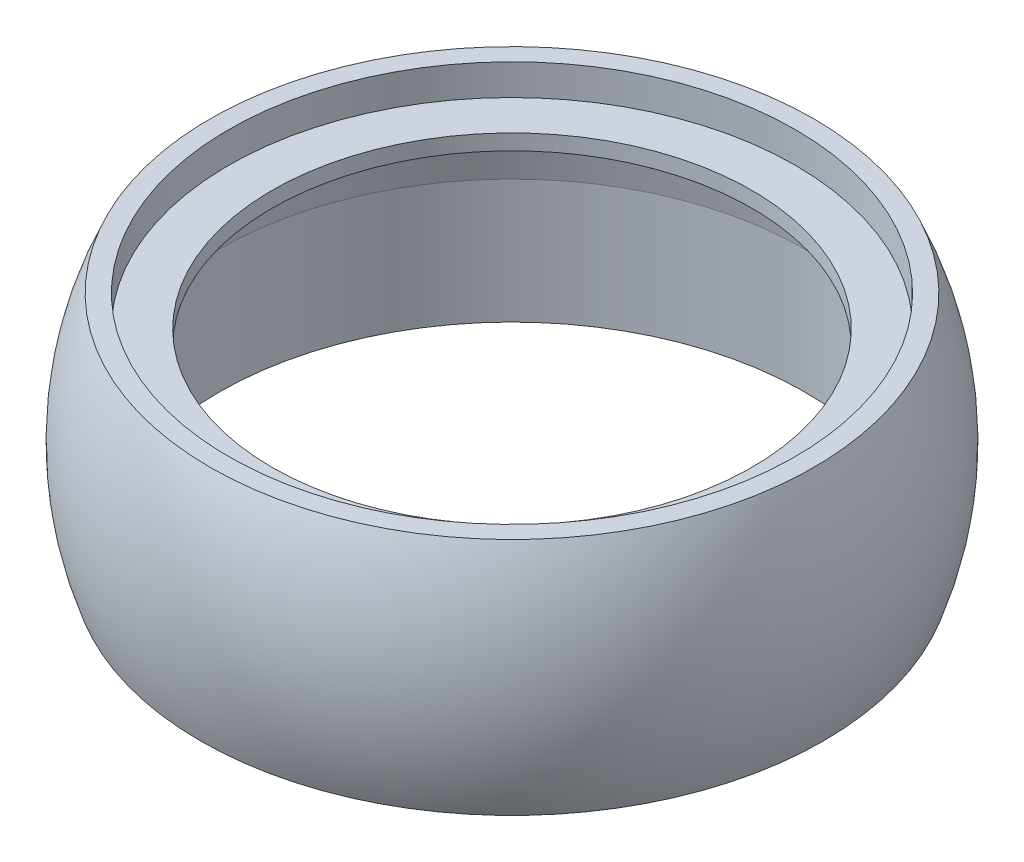
ISO-10303-21;
HEADER;
FILE_DESCRIPTION(('STEP AP214'),'2;1');
FILE_NAME('part.step','',(''),(''),'','','');
FILE_SCHEMA(('AUTOMOTIVE_DESIGN { 1 0 10303 214 1 1 1 1 }'));
ENDSEC;
DATA;
#1=APPLICATION_CONTEXT('core data for automotive mechanical design processes');
#2=APPLICATION_PROTOCOL_DEFINITION('international standard','automotive_design',2000,#1);
#3=PRODUCT_CONTEXT('',#1,'mechanical');
#4=PRODUCT('Part','Part','',(#3));
#5=PRODUCT_RELATED_PRODUCT_CATEGORY('part','',(#4));
#6=PRODUCT_DEFINITION_FORMATION('','',#4);
#7=PRODUCT_DEFINITION_CONTEXT('part definition',#1,'design');
#8=PRODUCT_DEFINITION('design','',#6,#7);
#9=PRODUCT_DEFINITION_SHAPE('','',#8);
#10=(LENGTH_UNIT() NAMED_UNIT(*) SI_UNIT(.MILLI.,.METRE.));
#11=(NAMED_UNIT(*) PLANE_ANGLE_UNIT() SI_UNIT($,.RADIAN.));
#12=(NAMED_UNIT(*) SI_UNIT($,.STERADIAN.) SOLID_ANGLE_UNIT());
#13=UNCERTAINTY_MEASURE_WITH_UNIT(LENGTH_MEASURE(1.E-05),#10,'distance_accuracy_value','');
#14=(GEOMETRIC_REPRESENTATION_CONTEXT(3) GLOBAL_UNCERTAINTY_ASSIGNED_CONTEXT((#13)) GLOBAL_UNIT_ASSIGNED_CONTEXT((#10,
#11,#12)) REPRESENTATION_CONTEXT('',''));
#15=CARTESIAN_POINT('',(0.,0.,0.));
#16=DIRECTION('',(0.,0.,1.));
#17=DIRECTION('',(1.,0.,0.));
#18=AXIS2_PLACEMENT_3D('',#15,#16,#17);
#19=CARTESIAN_POINT('',(0.,2.5,0.));
#20=DIRECTION('',(0.,1.,0.));
#21=DIRECTION('',(0.,0.,1.));
#22=AXIS2_PLACEMENT_3D('',#19,#20,#21);
#23=PLANE('',#22);
#24=CARTESIAN_POINT('',(0.,2.5,0.));
#25=DIRECTION('',(0.,1.,0.));
#26=DIRECTION('',(0.,0.,1.));
#27=AXIS2_PLACEMENT_3D('',#24,#25,#26);
#28=CIRCLE('',#27,38.75);
#29=CARTESIAN_POINT('',(0.,2.5,38.75));
#30=VERTEX_POINT('',#29);
#31=EDGE_CURVE('E10',#30,#30,#28,.T.);
#32=ORIENTED_EDGE('',*,*,#31,.F.);
#33=EDGE_LOOP('',(#32));
#34=FACE_BOUND('',#33,.T.);
#35=CARTESIAN_POINT('',(0.,2.5,0.));
#36=DIRECTION('',(0.,-1.,0.));
#37=DIRECTION('',(0.,0.,-1.));
#38=AXIS2_PLACEMENT_3D('',#35,#36,#37);
#39=CIRCLE('',#38,45.75);
#40=CARTESIAN_POINT('',(0.,2.5,-45.75));
#41=VERTEX_POINT('',#40);
#42=EDGE_CURVE('E74',#41,#41,#39,.T.);
#43=ORIENTED_EDGE('',*,*,#42,.F.);
#44=EDGE_LOOP('',(#43));
#45=FACE_BOUND('',#44,.T.);
#46=ADVANCED_FACE('F39',(#34,#45),#23,.T.);
#47=CARTESIAN_POINT('',(0.,0.,0.));
#48=DIRECTION('',(0.,1.,0.));
#49=DIRECTION('',(0.,0.,1.));
#50=AXIS2_PLACEMENT_3D('',#47,#48,#49);
#51=PLANE('',#50);
#52=CARTESIAN_POINT('',(0.,0.,0.));
#53=DIRECTION('',(0.,1.,0.));
#54=DIRECTION('',(-1.,0.,0.));
#55=AXIS2_PLACEMENT_3D('',#52,#53,#54);
#56=CIRCLE('',#55,45.8);
#57=CARTESIAN_POINT('',(-45.8,0.,0.));
#58=VERTEX_POINT('',#57);
#59=EDGE_CURVE('E65',#58,#58,#56,.T.);
#60=ORIENTED_EDGE('',*,*,#59,.F.);
#61=EDGE_LOOP('',(#60));
#62=FACE_BOUND('',#61,.T.);
#63=CARTESIAN_POINT('',(0.,0.,0.));
#64=DIRECTION('',(0.,1.,0.));
#65=DIRECTION('',(0.,0.,1.));
#66=AXIS2_PLACEMENT_3D('',#63,#64,#65);
#67=CIRCLE('',#66,38.75);
#68=CARTESIAN_POINT('',(0.,0.,38.75));
#69=VERTEX_POINT('',#68);
#70=EDGE_CURVE('E43',#69,#69,#67,.T.);
#71=ORIENTED_EDGE('',*,*,#70,.T.);
#72=EDGE_LOOP('',(#71));
#73=FACE_BOUND('',#72,.T.);
#74=ADVANCED_FACE('F41',(#62,#73),#51,.F.);
#75=CARTESIAN_POINT('',(0.,2.5,0.));
#76=DIRECTION('',(0.,-1.,0.));
#77=DIRECTION('',(0.,0.,-1.));
#78=AXIS2_PLACEMENT_3D('',#75,#76,#77);
#79=CYLINDRICAL_SURFACE('',#78,38.75);
#80=ORIENTED_EDGE('',*,*,#31,.T.);
#81=EDGE_LOOP('',(#80));
#82=FACE_BOUND('',#81,.T.);
#83=ORIENTED_EDGE('',*,*,#70,.F.);
#84=EDGE_LOOP('',(#83));
#85=FACE_BOUND('',#84,.T.);
#86=ADVANCED_FACE('F97',(#82,#85),#79,.F.);
#87=CARTESIAN_POINT('',(0.,-30.,0.));
#88=DIRECTION('',(0.,-1.,0.));
#89=DIRECTION('',(1.,0.,0.));
#90=AXIS2_PLACEMENT_3D('',#87,#88,#89);
#91=PLANE('',#90);
#92=CARTESIAN_POINT('',(0.,-30.,0.));
#93=DIRECTION('',(0.,1.,0.));
#94=DIRECTION('',(-1.,0.,0.));
#95=AXIS2_PLACEMENT_3D('',#92,#93,#94);
#96=CIRCLE('',#95,47.3);
#97=CARTESIAN_POINT('',(-47.3,-30.,0.));
#98=VERTEX_POINT('',#97);
#99=EDGE_CURVE('E57',#98,#98,#96,.T.);
#100=ORIENTED_EDGE('',*,*,#99,.T.);
#101=EDGE_LOOP('',(#100));
#102=FACE_BOUND('',#101,.T.);
#103=CARTESIAN_POINT('',(0.,-30.,0.));
#104=DIRECTION('',(0.,1.,0.));
#105=DIRECTION('',(-1.,0.,0.));
#106=AXIS2_PLACEMENT_3D('',#103,#104,#105);
#107=CIRCLE('',#106,50.3);
#108=CARTESIAN_POINT('',(-50.3,-30.,0.));
#109=VERTEX_POINT('',#108);
#110=EDGE_CURVE('E52',#109,#109,#107,.T.);
#111=ORIENTED_EDGE('',*,*,#110,.F.);
#112=EDGE_LOOP('',(#111));
#113=FACE_BOUND('',#112,.T.);
#114=ADVANCED_FACE('F102',(#102,#113),#91,.T.);
#115=CARTESIAN_POINT('',(0.,0.,0.));
#116=DIRECTION('',(0.,1.,0.));
#117=DIRECTION('',(-1.,0.,0.));
#118=AXIS2_PLACEMENT_3D('',#115,#116,#117);
#119=CYLINDRICAL_SURFACE('',#118,47.3);
#120=ORIENTED_EDGE('',*,*,#99,.F.);
#121=EDGE_LOOP('',(#120));
#122=FACE_BOUND('',#121,.T.);
#123=CARTESIAN_POINT('',(0.,-9.99999999999999,0.));
#124=DIRECTION('',(0.,1.,0.));
#125=DIRECTION('',(-1.,0.,0.));
#126=AXIS2_PLACEMENT_3D('',#123,#124,#125);
#127=CIRCLE('',#126,47.3);
#128=CARTESIAN_POINT('',(-47.3,-10.,0.));
#129=VERTEX_POINT('',#128);
#130=EDGE_CURVE('E61',#129,#129,#127,.T.);
#131=ORIENTED_EDGE('',*,*,#130,.T.);
#132=EDGE_LOOP('',(#131));
#133=FACE_BOUND('',#132,.T.);
#134=ADVANCED_FACE('F105',(#122,#133),#119,.F.);
#135=CARTESIAN_POINT('',(0.,0.,0.));
#136=DIRECTION('',(0.,-1.,0.));
#137=DIRECTION('',(1.,0.,0.));
#138=AXIS2_PLACEMENT_3D('',#135,#136,#137);
#139=CONICAL_SURFACE('',#138,45.8,0.148889947609497);
#140=ORIENTED_EDGE('',*,*,#130,.F.);
#141=EDGE_LOOP('',(#140));
#142=FACE_BOUND('',#141,.T.);
#143=ORIENTED_EDGE('',*,*,#59,.T.);
#144=EDGE_LOOP('',(#143));
#145=FACE_BOUND('',#144,.T.);
#146=ADVANCED_FACE('F109',(#142,#145),#139,.F.);
#147=CARTESIAN_POINT('',(0.,7.5,0.));
#148=DIRECTION('',(0.,-1.,0.));
#149=DIRECTION('',(0.,0.,-1.));
#150=AXIS2_PLACEMENT_3D('',#147,#148,#149);
#151=PLANE('',#150);
#152=CARTESIAN_POINT('',(0.,7.5,0.));
#153=DIRECTION('',(0.,-1.,0.));
#154=DIRECTION('',(0.,0.,-1.));
#155=AXIS2_PLACEMENT_3D('',#152,#153,#154);
#156=CIRCLE('',#155,45.75);
#157=CARTESIAN_POINT('',(0.,7.5,-45.75));
#158=VERTEX_POINT('',#157);
#159=EDGE_CURVE('E73',#158,#158,#156,.T.);
#160=ORIENTED_EDGE('',*,*,#159,.T.);
#161=EDGE_LOOP('',(#160));
#162=FACE_BOUND('',#161,.T.);
#163=CARTESIAN_POINT('',(0.,7.5,0.));
#164=DIRECTION('',(0.,-1.,0.));
#165=DIRECTION('',(0.,0.,-1.));
#166=AXIS2_PLACEMENT_3D('',#163,#164,#165);
#167=CIRCLE('',#166,48.75);
#168=CARTESIAN_POINT('',(0.,7.5,-48.75));
#169=VERTEX_POINT('',#168);
#170=EDGE_CURVE('E69',#169,#169,#167,.T.);
#171=ORIENTED_EDGE('',*,*,#170,.F.);
#172=EDGE_LOOP('',(#171));
#173=FACE_BOUND('',#172,.T.);
#174=ADVANCED_FACE('F82',(#162,#173),#151,.F.);
#175=CARTESIAN_POINT('',(0.,7.5,0.));
#176=DIRECTION('',(0.,-1.,0.));
#177=DIRECTION('',(0.,0.,-1.));
#178=AXIS2_PLACEMENT_3D('',#175,#176,#177);
#179=CYLINDRICAL_SURFACE('',#178,45.75);
#180=ORIENTED_EDGE('',*,*,#159,.F.);
#181=EDGE_LOOP('',(#180));
#182=FACE_BOUND('',#181,.T.);
#183=ORIENTED_EDGE('',*,*,#42,.T.);
#184=EDGE_LOOP('',(#183));
#185=FACE_BOUND('',#184,.T.);
#186=ADVANCED_FACE('F85',(#182,#185),#179,.F.);
#187=CARTESIAN_POINT('',(0.,-13.1639492156909,0.));
#188=DIRECTION('',(0.,-1.,0.));
#189=DIRECTION('',(0.,0.,-1.));
#190=AXIS2_PLACEMENT_3D('',#187,#188,#189);
#191=DEGENERATE_TOROIDAL_SURFACE('',#190,3.21977703973603,50.,.T.);
#192=ORIENTED_EDGE('',*,*,#110,.T.);
#193=EDGE_LOOP('',(#192));
#194=FACE_BOUND('',#193,.T.);
#195=ORIENTED_EDGE('',*,*,#170,.T.);
#196=EDGE_LOOP('',(#195));
#197=FACE_BOUND('',#196,.T.);
#198=ADVANCED_FACE('F88',(#194,#197),#191,.T.);
#199=CLOSED_SHELL('',(#46,#74,#86,#114,#134,#146,#174,#186,#198));
#200=MANIFOLD_SOLID_BREP('B2',#199);
#201=ADVANCED_BREP_SHAPE_REPRESENTATION('',(#18,#200),#14);
#202=SHAPE_DEFINITION_REPRESENTATION(#9,#201);
ENDSEC;
END-ISO-10303-21;
